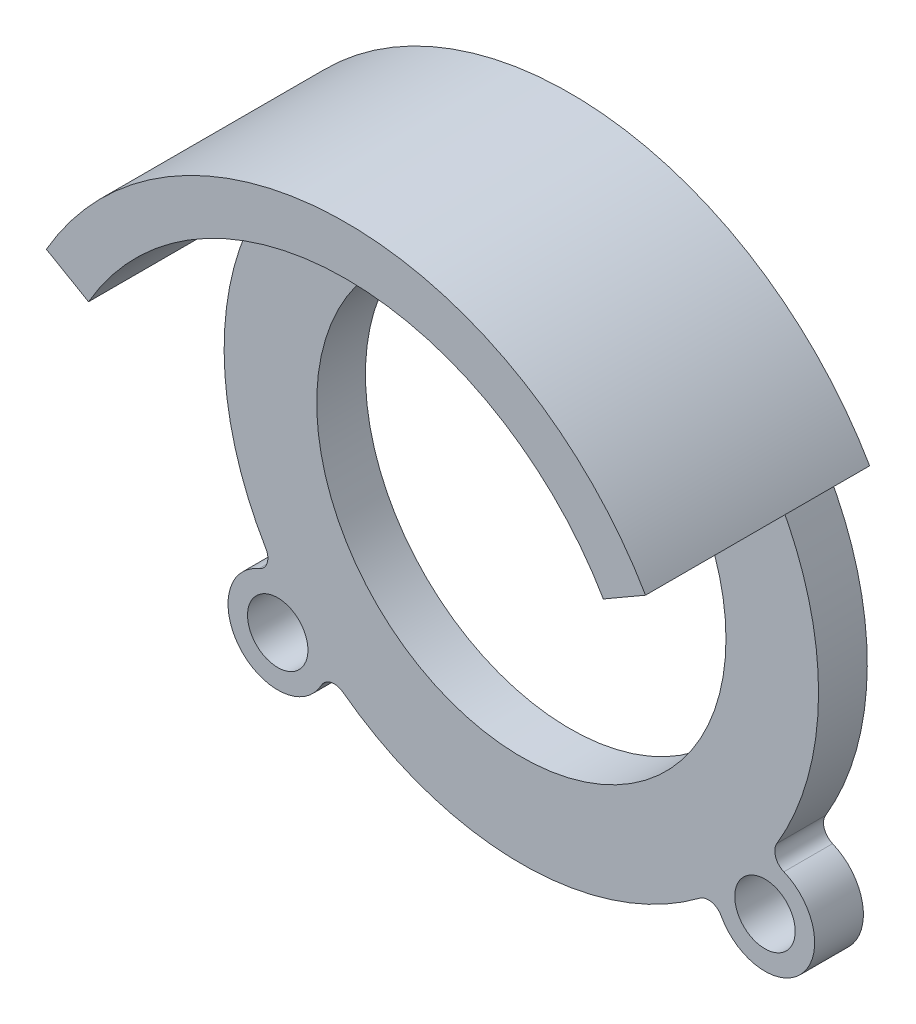
ISO-10303-21;
HEADER;
FILE_DESCRIPTION(('STEP AP214'),'2;1');
FILE_NAME('part.step','',(''),(''),'','','');
FILE_SCHEMA(('AUTOMOTIVE_DESIGN { 1 0 10303 214 1 1 1 1 }'));
ENDSEC;
DATA;
#1=APPLICATION_CONTEXT('core data for automotive mechanical design processes');
#2=APPLICATION_PROTOCOL_DEFINITION('international standard','automotive_design',2000,#1);
#3=PRODUCT_CONTEXT('',#1,'mechanical');
#4=PRODUCT('Part','Part','',(#3));
#5=PRODUCT_RELATED_PRODUCT_CATEGORY('part','',(#4));
#6=PRODUCT_DEFINITION_FORMATION('','',#4);
#7=PRODUCT_DEFINITION_CONTEXT('part definition',#1,'design');
#8=PRODUCT_DEFINITION('design','',#6,#7);
#9=PRODUCT_DEFINITION_SHAPE('','',#8);
#10=(LENGTH_UNIT() NAMED_UNIT(*) SI_UNIT(.MILLI.,.METRE.));
#11=(NAMED_UNIT(*) PLANE_ANGLE_UNIT() SI_UNIT($,.RADIAN.));
#12=(NAMED_UNIT(*) SI_UNIT($,.STERADIAN.) SOLID_ANGLE_UNIT());
#13=UNCERTAINTY_MEASURE_WITH_UNIT(LENGTH_MEASURE(1.E-05),#10,'distance_accuracy_value','');
#14=(GEOMETRIC_REPRESENTATION_CONTEXT(3) GLOBAL_UNCERTAINTY_ASSIGNED_CONTEXT((#13)) GLOBAL_UNIT_ASSIGNED_CONTEXT((#10,
#11,#12)) REPRESENTATION_CONTEXT('',''));
#15=CARTESIAN_POINT('',(0.,0.,0.));
#16=DIRECTION('',(0.,0.,1.));
#17=DIRECTION('',(1.,0.,0.));
#18=AXIS2_PLACEMENT_3D('',#15,#16,#17);
#19=CARTESIAN_POINT('',(0.,0.,5.));
#20=DIRECTION('',(0.,0.,-1.));
#21=DIRECTION('',(-1.,0.,0.));
#22=AXIS2_PLACEMENT_3D('',#19,#20,#21);
#23=PLANE('',#22);
#24=CARTESIAN_POINT('',(-25.,-22.4490534321606,5.));
#25=DIRECTION('',(0.,0.,1.));
#26=DIRECTION('',(1.,0.,0.));
#27=AXIS2_PLACEMENT_3D('',#24,#25,#26);
#28=CIRCLE('',#27,3.1);
#29=CARTESIAN_POINT('',(-21.9,-22.4490534321606,5.));
#30=VERTEX_POINT('',#29);
#31=EDGE_CURVE('E282',#30,#30,#28,.T.);
#32=ORIENTED_EDGE('',*,*,#31,.F.);
#33=EDGE_LOOP('',(#32));
#34=FACE_BOUND('',#33,.T.);
#35=CARTESIAN_POINT('',(25.,-22.4490534321606,5.));
#36=DIRECTION('',(0.,0.,1.));
#37=DIRECTION('',(1.,0.,0.));
#38=AXIS2_PLACEMENT_3D('',#35,#36,#37);
#39=CIRCLE('',#38,3.1);
#40=CARTESIAN_POINT('',(28.1,-22.4490534321606,5.));
#41=VERTEX_POINT('',#40);
#42=EDGE_CURVE('E274',#41,#41,#39,.T.);
#43=ORIENTED_EDGE('',*,*,#42,.F.);
#44=EDGE_LOOP('',(#43));
#45=FACE_BOUND('',#44,.T.);
#46=CARTESIAN_POINT('',(0.,0.,5.));
#47=DIRECTION('',(0.,0.,1.));
#48=DIRECTION('',(1.,0.,0.));
#49=AXIS2_PLACEMENT_3D('',#46,#47,#48);
#50=CIRCLE('',#49,21.);
#51=CARTESIAN_POINT('',(21.,0.,5.));
#52=VERTEX_POINT('',#51);
#53=EDGE_CURVE('E173',#52,#52,#50,.T.);
#54=ORIENTED_EDGE('',*,*,#53,.F.);
#55=EDGE_LOOP('',(#54));
#56=FACE_BOUND('',#55,.T.);
#57=CARTESIAN_POINT('',(0.,0.,5.));
#58=DIRECTION('',(0.,0.,-1.));
#59=DIRECTION('',(-1.,0.,0.));
#60=AXIS2_PLACEMENT_3D('',#57,#58,#59);
#61=CIRCLE('',#60,30.5);
#62=CARTESIAN_POINT('',(-26.4137748154254,15.2499999999999,5.));
#63=VERTEX_POINT('',#62);
#64=CARTESIAN_POINT('',(26.4137748154254,15.25,5.));
#65=VERTEX_POINT('',#64);
#66=EDGE_CURVE('E113',#63,#65,#61,.T.);
#67=ORIENTED_EDGE('',*,*,#66,.F.);
#68=CARTESIAN_POINT('',(0.,0.,5.));
#69=DIRECTION('',(0.,0.,1.));
#70=DIRECTION('',(1.,0.,0.));
#71=AXIS2_PLACEMENT_3D('',#68,#69,#70);
#72=CIRCLE('',#71,30.5);
#73=CARTESIAN_POINT('',(-26.2210538799125,-15.579035060835,5.));
#74=VERTEX_POINT('',#73);
#75=EDGE_CURVE('E203',#63,#74,#72,.T.);
#76=ORIENTED_EDGE('',*,*,#75,.T.);
#77=CARTESIAN_POINT('',(-27.5106139067934,-16.3452171130072,5.));
#78=DIRECTION('',(0.,0.,-1.));
#79=DIRECTION('',(1.,0.,0.));
#80=AXIS2_PLACEMENT_3D('',#77,#78,#79);
#81=CIRCLE('',#80,1.5);
#82=CARTESIAN_POINT('',(-26.9400198370676,-17.7324526400875,5.));
#83=VERTEX_POINT('',#82);
#84=EDGE_CURVE('E260',#74,#83,#81,.T.);
#85=ORIENTED_EDGE('',*,*,#84,.T.);
#86=CARTESIAN_POINT('',(-25.,-22.4490534321606,5.));
#87=DIRECTION('',(0.,0.,1.));
#88=DIRECTION('',(1.,0.,0.));
#89=AXIS2_PLACEMENT_3D('',#86,#87,#88);
#90=CIRCLE('',#89,5.1);
#91=CARTESIAN_POINT('',(-20.5185824485436,-24.8835753009262,5.));
#92=VERTEX_POINT('',#91);
#93=EDGE_CURVE('E256',#83,#92,#90,.T.);
#94=ORIENTED_EDGE('',*,*,#93,.T.);
#95=CARTESIAN_POINT('',(-19.2005184628211,-25.5996111446808,5.));
#96=DIRECTION('',(0.,0.,-1.));
#97=DIRECTION('',(1.,0.,0.));
#98=AXIS2_PLACEMENT_3D('',#95,#96,#97);
#99=CIRCLE('',#98,1.5);
#100=CARTESIAN_POINT('',(-18.3004941598763,-24.3996293722739,5.));
#101=VERTEX_POINT('',#100);
#102=EDGE_CURVE('E259',#92,#101,#99,.T.);
#103=ORIENTED_EDGE('',*,*,#102,.T.);
#104=CARTESIAN_POINT('',(0.,0.,5.));
#105=DIRECTION('',(0.,0.,1.));
#106=DIRECTION('',(1.,0.,0.));
#107=AXIS2_PLACEMENT_3D('',#104,#105,#106);
#108=CIRCLE('',#107,30.5);
#109=CARTESIAN_POINT('',(18.3004941598763,-24.3996293722739,5.));
#110=VERTEX_POINT('',#109);
#111=EDGE_CURVE('E139',#101,#110,#108,.T.);
#112=ORIENTED_EDGE('',*,*,#111,.T.);
#113=CARTESIAN_POINT('',(19.2005184628211,-25.5996111446808,5.));
#114=DIRECTION('',(0.,0.,-1.));
#115=DIRECTION('',(1.,0.,0.));
#116=AXIS2_PLACEMENT_3D('',#113,#114,#115);
#117=CIRCLE('',#116,1.5);
#118=CARTESIAN_POINT('',(20.5185824485436,-24.8835753009262,5.));
#119=VERTEX_POINT('',#118);
#120=EDGE_CURVE('E133',#110,#119,#117,.T.);
#121=ORIENTED_EDGE('',*,*,#120,.T.);
#122=CARTESIAN_POINT('',(25.,-22.4490534321606,5.));
#123=DIRECTION('',(0.,0.,1.));
#124=DIRECTION('',(1.,0.,0.));
#125=AXIS2_PLACEMENT_3D('',#122,#123,#124);
#126=CIRCLE('',#125,5.1);
#127=CARTESIAN_POINT('',(26.9400198370677,-17.7324526400875,5.));
#128=VERTEX_POINT('',#127);
#129=EDGE_CURVE('E136',#119,#128,#126,.T.);
#130=ORIENTED_EDGE('',*,*,#129,.T.);
#131=CARTESIAN_POINT('',(27.5106139067934,-16.3452171130072,5.));
#132=DIRECTION('',(0.,0.,-1.));
#133=DIRECTION('',(1.,0.,0.));
#134=AXIS2_PLACEMENT_3D('',#131,#132,#133);
#135=CIRCLE('',#134,1.5);
#136=CARTESIAN_POINT('',(26.2210538799125,-15.579035060835,5.));
#137=VERTEX_POINT('',#136);
#138=EDGE_CURVE('E57',#128,#137,#135,.T.);
#139=ORIENTED_EDGE('',*,*,#138,.T.);
#140=CARTESIAN_POINT('',(0.,0.,5.));
#141=DIRECTION('',(0.,0.,1.));
#142=DIRECTION('',(1.,0.,0.));
#143=AXIS2_PLACEMENT_3D('',#140,#141,#142);
#144=CIRCLE('',#143,30.5);
#145=EDGE_CURVE('E161',#137,#65,#144,.T.);
#146=ORIENTED_EDGE('',*,*,#145,.T.);
#147=EDGE_LOOP('',(#67,#76,#85,#94,#103,#112,#121,#130,#139,#146));
#148=FACE_BOUND('',#147,.T.);
#149=ADVANCED_FACE('F39',(#34,#45,#56,#148),#23,.F.);
#150=CARTESIAN_POINT('',(0.,0.,0.));
#151=DIRECTION('',(0.,0.,-1.));
#152=DIRECTION('',(-1.,0.,0.));
#153=AXIS2_PLACEMENT_3D('',#150,#151,#152);
#154=PLANE('',#153);
#155=CARTESIAN_POINT('',(25.,-22.4490534321606,0.));
#156=DIRECTION('',(0.,0.,1.));
#157=DIRECTION('',(1.,0.,0.));
#158=AXIS2_PLACEMENT_3D('',#155,#156,#157);
#159=CIRCLE('',#158,3.1);
#160=CARTESIAN_POINT('',(28.1,-22.4490534321606,0.));
#161=VERTEX_POINT('',#160);
#162=EDGE_CURVE('E278',#161,#161,#159,.T.);
#163=ORIENTED_EDGE('',*,*,#162,.T.);
#164=EDGE_LOOP('',(#163));
#165=FACE_BOUND('',#164,.T.);
#166=CARTESIAN_POINT('',(0.,0.,0.));
#167=DIRECTION('',(0.,0.,1.));
#168=DIRECTION('',(-1.,0.,0.));
#169=AXIS2_PLACEMENT_3D('',#166,#167,#168);
#170=CIRCLE('',#169,35.5);
#171=CARTESIAN_POINT('',(30.7439018343476,17.7499999999999,0.));
#172=VERTEX_POINT('',#171);
#173=CARTESIAN_POINT('',(-30.7439018343476,17.7499999999999,0.));
#174=VERTEX_POINT('',#173);
#175=EDGE_CURVE('E168',#172,#174,#170,.T.);
#176=ORIENTED_EDGE('',*,*,#175,.F.);
#177=DIRECTION('',(0.866025403784449,0.499999999999982,0.));
#178=VECTOR('',#177,1.);
#179=CARTESIAN_POINT('',(26.4137748154254,15.25,0.));
#180=LINE('',#179,#178);
#181=CARTESIAN_POINT('',(26.4137748154254,15.25,0.));
#182=VERTEX_POINT('',#181);
#183=EDGE_CURVE('E106',#182,#172,#180,.T.);
#184=ORIENTED_EDGE('',*,*,#183,.F.);
#185=CARTESIAN_POINT('',(0.,0.,0.));
#186=DIRECTION('',(0.,0.,1.));
#187=DIRECTION('',(1.,0.,0.));
#188=AXIS2_PLACEMENT_3D('',#185,#186,#187);
#189=CIRCLE('',#188,30.5);
#190=CARTESIAN_POINT('',(26.2210538799125,-15.579035060835,0.));
#191=VERTEX_POINT('',#190);
#192=EDGE_CURVE('E99',#191,#182,#189,.T.);
#193=ORIENTED_EDGE('',*,*,#192,.F.);
#194=CARTESIAN_POINT('',(27.5106139067934,-16.3452171130072,0.));
#195=DIRECTION('',(0.,0.,-1.));
#196=DIRECTION('',(1.,0.,0.));
#197=AXIS2_PLACEMENT_3D('',#194,#195,#196);
#198=CIRCLE('',#197,1.5);
#199=CARTESIAN_POINT('',(26.9400198370677,-17.7324526400875,0.));
#200=VERTEX_POINT('',#199);
#201=EDGE_CURVE('E196',#200,#191,#198,.T.);
#202=ORIENTED_EDGE('',*,*,#201,.F.);
#203=CARTESIAN_POINT('',(25.,-22.4490534321606,0.));
#204=DIRECTION('',(0.,0.,1.));
#205=DIRECTION('',(1.,0.,0.));
#206=AXIS2_PLACEMENT_3D('',#203,#204,#205);
#207=CIRCLE('',#206,5.1);
#208=CARTESIAN_POINT('',(20.5185824485436,-24.8835753009262,0.));
#209=VERTEX_POINT('',#208);
#210=EDGE_CURVE('E193',#209,#200,#207,.T.);
#211=ORIENTED_EDGE('',*,*,#210,.F.);
#212=CARTESIAN_POINT('',(19.2005184628211,-25.5996111446808,0.));
#213=DIRECTION('',(0.,0.,-1.));
#214=DIRECTION('',(1.,0.,0.));
#215=AXIS2_PLACEMENT_3D('',#212,#213,#214);
#216=CIRCLE('',#215,1.5);
#217=CARTESIAN_POINT('',(18.3004941598763,-24.3996293722739,0.));
#218=VERTEX_POINT('',#217);
#219=EDGE_CURVE('E149',#218,#209,#216,.T.);
#220=ORIENTED_EDGE('',*,*,#219,.F.);
#221=CARTESIAN_POINT('',(0.,0.,0.));
#222=DIRECTION('',(0.,0.,1.));
#223=DIRECTION('',(1.,0.,0.));
#224=AXIS2_PLACEMENT_3D('',#221,#222,#223);
#225=CIRCLE('',#224,30.5);
#226=CARTESIAN_POINT('',(-18.3004941598763,-24.3996293722739,0.));
#227=VERTEX_POINT('',#226);
#228=EDGE_CURVE('E188',#227,#218,#225,.T.);
#229=ORIENTED_EDGE('',*,*,#228,.F.);
#230=CARTESIAN_POINT('',(-19.2005184628211,-25.5996111446808,0.));
#231=DIRECTION('',(0.,0.,-1.));
#232=DIRECTION('',(1.,0.,0.));
#233=AXIS2_PLACEMENT_3D('',#230,#231,#232);
#234=CIRCLE('',#233,1.5);
#235=CARTESIAN_POINT('',(-20.5185824485436,-24.8835753009262,0.));
#236=VERTEX_POINT('',#235);
#237=EDGE_CURVE('E185',#236,#227,#234,.T.);
#238=ORIENTED_EDGE('',*,*,#237,.F.);
#239=CARTESIAN_POINT('',(-25.,-22.4490534321606,0.));
#240=DIRECTION('',(0.,0.,1.));
#241=DIRECTION('',(1.,0.,0.));
#242=AXIS2_PLACEMENT_3D('',#239,#240,#241);
#243=CIRCLE('',#242,5.1);
#244=CARTESIAN_POINT('',(-26.9400198370676,-17.7324526400875,0.));
#245=VERTEX_POINT('',#244);
#246=EDGE_CURVE('E182',#245,#236,#243,.T.);
#247=ORIENTED_EDGE('',*,*,#246,.F.);
#248=CARTESIAN_POINT('',(-27.5106139067934,-16.3452171130072,0.));
#249=DIRECTION('',(0.,0.,-1.));
#250=DIRECTION('',(1.,0.,0.));
#251=AXIS2_PLACEMENT_3D('',#248,#249,#250);
#252=CIRCLE('',#251,1.5);
#253=CARTESIAN_POINT('',(-26.2210538799125,-15.579035060835,0.));
#254=VERTEX_POINT('',#253);
#255=EDGE_CURVE('E179',#254,#245,#252,.T.);
#256=ORIENTED_EDGE('',*,*,#255,.F.);
#257=CARTESIAN_POINT('',(0.,0.,0.));
#258=DIRECTION('',(0.,0.,1.));
#259=DIRECTION('',(1.,0.,0.));
#260=AXIS2_PLACEMENT_3D('',#257,#258,#259);
#261=CIRCLE('',#260,30.5);
#262=CARTESIAN_POINT('',(-26.4137748154254,15.2499999999999,0.));
#263=VERTEX_POINT('',#262);
#264=EDGE_CURVE('E176',#263,#254,#261,.T.);
#265=ORIENTED_EDGE('',*,*,#264,.F.);
#266=DIRECTION('',(0.86602540378444,-0.499999999999998,0.));
#267=VECTOR('',#266,1.);
#268=CARTESIAN_POINT('',(-26.4137748154254,15.2499999999999,0.));
#269=LINE('',#268,#267);
#270=EDGE_CURVE('E172',#174,#263,#269,.T.);
#271=ORIENTED_EDGE('',*,*,#270,.F.);
#272=EDGE_LOOP('',(#176,#184,#193,#202,#211,#220,#229,#238,#247,#256,#265,#271));
#273=FACE_BOUND('',#272,.T.);
#274=CARTESIAN_POINT('',(0.,0.,0.));
#275=DIRECTION('',(0.,0.,1.));
#276=DIRECTION('',(1.,0.,0.));
#277=AXIS2_PLACEMENT_3D('',#274,#275,#276);
#278=CIRCLE('',#277,21.);
#279=CARTESIAN_POINT('',(21.,0.,0.));
#280=VERTEX_POINT('',#279);
#281=EDGE_CURVE('E270',#280,#280,#278,.T.);
#282=ORIENTED_EDGE('',*,*,#281,.T.);
#283=EDGE_LOOP('',(#282));
#284=FACE_BOUND('',#283,.T.);
#285=CARTESIAN_POINT('',(-25.,-22.4490534321606,0.));
#286=DIRECTION('',(0.,0.,1.));
#287=DIRECTION('',(1.,0.,0.));
#288=AXIS2_PLACEMENT_3D('',#285,#286,#287);
#289=CIRCLE('',#288,3.1);
#290=CARTESIAN_POINT('',(-21.9,-22.4490534321606,0.));
#291=VERTEX_POINT('',#290);
#292=EDGE_CURVE('E286',#291,#291,#289,.T.);
#293=ORIENTED_EDGE('',*,*,#292,.T.);
#294=EDGE_LOOP('',(#293));
#295=FACE_BOUND('',#294,.T.);
#296=ADVANCED_FACE('F244',(#165,#273,#284,#295),#154,.T.);
#297=CARTESIAN_POINT('',(0.,0.,5.));
#298=DIRECTION('',(0.,0.,-1.));
#299=DIRECTION('',(-1.,0.,0.));
#300=AXIS2_PLACEMENT_3D('',#297,#298,#299);
#301=CYLINDRICAL_SURFACE('',#300,35.5);
#302=ORIENTED_EDGE('',*,*,#175,.T.);
#303=DIRECTION('',(0.,0.,-1.));
#304=VECTOR('',#303,1.);
#305=CARTESIAN_POINT('',(-30.7439018343476,17.7499999999999,5.));
#306=LINE('',#305,#304);
#307=CARTESIAN_POINT('',(-30.7439018343476,17.75,23.));
#308=VERTEX_POINT('',#307);
#309=EDGE_CURVE('E11',#308,#174,#306,.T.);
#310=ORIENTED_EDGE('',*,*,#309,.F.);
#311=CARTESIAN_POINT('',(0.,0.,23.));
#312=DIRECTION('',(0.,0.,1.));
#313=DIRECTION('',(-1.,0.,0.));
#314=AXIS2_PLACEMENT_3D('',#311,#312,#313);
#315=CIRCLE('',#314,35.5);
#316=CARTESIAN_POINT('',(30.7439018343476,17.75,23.));
#317=VERTEX_POINT('',#316);
#318=EDGE_CURVE('E307',#317,#308,#315,.T.);
#319=ORIENTED_EDGE('',*,*,#318,.F.);
#320=DIRECTION('',(0.,0.,-1.));
#321=VECTOR('',#320,1.);
#322=CARTESIAN_POINT('',(30.7439018343476,17.7499999999999,5.));
#323=LINE('',#322,#321);
#324=EDGE_CURVE('E167',#317,#172,#323,.T.);
#325=ORIENTED_EDGE('',*,*,#324,.T.);
#326=EDGE_LOOP('',(#302,#310,#319,#325));
#327=FACE_BOUND('',#326,.T.);
#328=ADVANCED_FACE('F41',(#327),#301,.T.);
#329=CARTESIAN_POINT('',(-26.4137748154254,15.2499999999999,5.));
#330=DIRECTION('',(0.499999999999998,0.86602540378444,0.));
#331=DIRECTION('',(-0.86602540378444,0.499999999999998,0.));
#332=AXIS2_PLACEMENT_3D('',#329,#330,#331);
#333=PLANE('',#332);
#334=ORIENTED_EDGE('',*,*,#270,.T.);
#335=DIRECTION('',(0.,0.,-1.));
#336=VECTOR('',#335,1.);
#337=CARTESIAN_POINT('',(-26.4137748154254,15.2499999999999,5.));
#338=LINE('',#337,#336);
#339=EDGE_CURVE('E49',#63,#263,#338,.T.);
#340=ORIENTED_EDGE('',*,*,#339,.F.);
#341=DIRECTION('',(0.,0.,-1.));
#342=VECTOR('',#341,1.);
#343=CARTESIAN_POINT('',(-26.4137748154254,15.25,23.));
#344=LINE('',#343,#342);
#345=CARTESIAN_POINT('',(-26.4137748154254,15.25,23.));
#346=VERTEX_POINT('',#345);
#347=EDGE_CURVE('E297',#346,#63,#344,.T.);
#348=ORIENTED_EDGE('',*,*,#347,.F.);
#349=DIRECTION('',(0.866025403784438,-0.500000000000001,0.));
#350=VECTOR('',#349,1.);
#351=CARTESIAN_POINT('',(-26.4137748154254,15.25,23.));
#352=LINE('',#351,#350);
#353=EDGE_CURVE('E300',#308,#346,#352,.T.);
#354=ORIENTED_EDGE('',*,*,#353,.F.);
#355=ORIENTED_EDGE('',*,*,#309,.T.);
#356=EDGE_LOOP('',(#334,#340,#348,#354,#355));
#357=FACE_BOUND('',#356,.T.);
#358=ADVANCED_FACE('F339',(#357),#333,.F.);
#359=CARTESIAN_POINT('',(0.,0.,5.));
#360=DIRECTION('',(0.,0.,-1.));
#361=DIRECTION('',(-1.,0.,0.));
#362=AXIS2_PLACEMENT_3D('',#359,#360,#361);
#363=CYLINDRICAL_SURFACE('',#362,30.5);
#364=ORIENTED_EDGE('',*,*,#264,.T.);
#365=DIRECTION('',(0.,0.,-1.));
#366=VECTOR('',#365,1.);
#367=CARTESIAN_POINT('',(-26.2210538799125,-15.579035060835,5.));
#368=LINE('',#367,#366);
#369=EDGE_CURVE('E228',#74,#254,#368,.T.);
#370=ORIENTED_EDGE('',*,*,#369,.F.);
#371=ORIENTED_EDGE('',*,*,#75,.F.);
#372=ORIENTED_EDGE('',*,*,#339,.T.);
#373=EDGE_LOOP('',(#364,#370,#371,#372));
#374=FACE_BOUND('',#373,.T.);
#375=ADVANCED_FACE('F236',(#374),#363,.T.);
#376=CARTESIAN_POINT('',(-27.5106139067934,-16.3452171130072,5.));
#377=DIRECTION('',(0.,0.,-1.));
#378=DIRECTION('',(-1.,0.,0.));
#379=AXIS2_PLACEMENT_3D('',#376,#377,#378);
#380=CYLINDRICAL_SURFACE('',#379,1.5);
#381=ORIENTED_EDGE('',*,*,#255,.T.);
#382=DIRECTION('',(0.,0.,-1.));
#383=VECTOR('',#382,1.);
#384=CARTESIAN_POINT('',(-26.9400198370676,-17.7324526400875,5.));
#385=LINE('',#384,#383);
#386=EDGE_CURVE('E224',#83,#245,#385,.T.);
#387=ORIENTED_EDGE('',*,*,#386,.F.);
#388=ORIENTED_EDGE('',*,*,#84,.F.);
#389=ORIENTED_EDGE('',*,*,#369,.T.);
#390=EDGE_LOOP('',(#381,#387,#388,#389));
#391=FACE_BOUND('',#390,.T.);
#392=ADVANCED_FACE('F250',(#391),#380,.F.);
#393=CARTESIAN_POINT('',(-25.,-22.4490534321606,5.));
#394=DIRECTION('',(0.,0.,-1.));
#395=DIRECTION('',(-1.,0.,0.));
#396=AXIS2_PLACEMENT_3D('',#393,#394,#395);
#397=CYLINDRICAL_SURFACE('',#396,5.1);
#398=ORIENTED_EDGE('',*,*,#246,.T.);
#399=DIRECTION('',(0.,0.,-1.));
#400=VECTOR('',#399,1.);
#401=CARTESIAN_POINT('',(-20.5185824485436,-24.8835753009262,5.));
#402=LINE('',#401,#400);
#403=EDGE_CURVE('E220',#92,#236,#402,.T.);
#404=ORIENTED_EDGE('',*,*,#403,.F.);
#405=ORIENTED_EDGE('',*,*,#93,.F.);
#406=ORIENTED_EDGE('',*,*,#386,.T.);
#407=EDGE_LOOP('',(#398,#404,#405,#406));
#408=FACE_BOUND('',#407,.T.);
#409=ADVANCED_FACE('F254',(#408),#397,.T.);
#410=CARTESIAN_POINT('',(-19.2005184628211,-25.5996111446808,5.));
#411=DIRECTION('',(0.,0.,-1.));
#412=DIRECTION('',(-1.,0.,0.));
#413=AXIS2_PLACEMENT_3D('',#410,#411,#412);
#414=CYLINDRICAL_SURFACE('',#413,1.5);
#415=ORIENTED_EDGE('',*,*,#237,.T.);
#416=DIRECTION('',(0.,0.,-1.));
#417=VECTOR('',#416,1.);
#418=CARTESIAN_POINT('',(-18.3004941598763,-24.3996293722739,5.));
#419=LINE('',#418,#417);
#420=EDGE_CURVE('E216',#101,#227,#419,.T.);
#421=ORIENTED_EDGE('',*,*,#420,.F.);
#422=ORIENTED_EDGE('',*,*,#102,.F.);
#423=ORIENTED_EDGE('',*,*,#403,.T.);
#424=EDGE_LOOP('',(#415,#421,#422,#423));
#425=FACE_BOUND('',#424,.T.);
#426=ADVANCED_FACE('F374',(#425),#414,.F.);
#427=CARTESIAN_POINT('',(0.,0.,5.));
#428=DIRECTION('',(0.,0.,-1.));
#429=DIRECTION('',(-1.,0.,0.));
#430=AXIS2_PLACEMENT_3D('',#427,#428,#429);
#431=CYLINDRICAL_SURFACE('',#430,30.5);
#432=ORIENTED_EDGE('',*,*,#228,.T.);
#433=DIRECTION('',(0.,0.,-1.));
#434=VECTOR('',#433,1.);
#435=CARTESIAN_POINT('',(18.3004941598763,-24.3996293722739,5.));
#436=LINE('',#435,#434);
#437=EDGE_CURVE('E153',#110,#218,#436,.T.);
#438=ORIENTED_EDGE('',*,*,#437,.F.);
#439=ORIENTED_EDGE('',*,*,#111,.F.);
#440=ORIENTED_EDGE('',*,*,#420,.T.);
#441=EDGE_LOOP('',(#432,#438,#439,#440));
#442=FACE_BOUND('',#441,.T.);
#443=ADVANCED_FACE('F371',(#442),#431,.T.);
#444=CARTESIAN_POINT('',(19.2005184628211,-25.5996111446808,5.));
#445=DIRECTION('',(0.,0.,-1.));
#446=DIRECTION('',(-1.,0.,0.));
#447=AXIS2_PLACEMENT_3D('',#444,#445,#446);
#448=CYLINDRICAL_SURFACE('',#447,1.5);
#449=ORIENTED_EDGE('',*,*,#219,.T.);
#450=DIRECTION('',(0.,0.,-1.));
#451=VECTOR('',#450,1.);
#452=CARTESIAN_POINT('',(20.5185824485436,-24.8835753009262,5.));
#453=LINE('',#452,#451);
#454=EDGE_CURVE('E146',#119,#209,#453,.T.);
#455=ORIENTED_EDGE('',*,*,#454,.F.);
#456=ORIENTED_EDGE('',*,*,#120,.F.);
#457=ORIENTED_EDGE('',*,*,#437,.T.);
#458=EDGE_LOOP('',(#449,#455,#456,#457));
#459=FACE_BOUND('',#458,.T.);
#460=ADVANCED_FACE('F147',(#459),#448,.F.);
#461=CARTESIAN_POINT('',(25.,-22.4490534321606,5.));
#462=DIRECTION('',(0.,0.,-1.));
#463=DIRECTION('',(-1.,0.,0.));
#464=AXIS2_PLACEMENT_3D('',#461,#462,#463);
#465=CYLINDRICAL_SURFACE('',#464,5.1);
#466=ORIENTED_EDGE('',*,*,#210,.T.);
#467=DIRECTION('',(0.,0.,-1.));
#468=VECTOR('',#467,1.);
#469=CARTESIAN_POINT('',(26.9400198370677,-17.7324526400875,5.));
#470=LINE('',#469,#468);
#471=EDGE_CURVE('E154',#128,#200,#470,.T.);
#472=ORIENTED_EDGE('',*,*,#471,.F.);
#473=ORIENTED_EDGE('',*,*,#129,.F.);
#474=ORIENTED_EDGE('',*,*,#454,.T.);
#475=EDGE_LOOP('',(#466,#472,#473,#474));
#476=FACE_BOUND('',#475,.T.);
#477=ADVANCED_FACE('F156',(#476),#465,.T.);
#478=CARTESIAN_POINT('',(27.5106139067934,-16.3452171130072,5.));
#479=DIRECTION('',(0.,0.,-1.));
#480=DIRECTION('',(-1.,0.,0.));
#481=AXIS2_PLACEMENT_3D('',#478,#479,#480);
#482=CYLINDRICAL_SURFACE('',#481,1.5);
#483=ORIENTED_EDGE('',*,*,#201,.T.);
#484=DIRECTION('',(0.,0.,-1.));
#485=VECTOR('',#484,1.);
#486=CARTESIAN_POINT('',(26.2210538799125,-15.579035060835,5.));
#487=LINE('',#486,#485);
#488=EDGE_CURVE('E209',#137,#191,#487,.T.);
#489=ORIENTED_EDGE('',*,*,#488,.F.);
#490=ORIENTED_EDGE('',*,*,#138,.F.);
#491=ORIENTED_EDGE('',*,*,#471,.T.);
#492=EDGE_LOOP('',(#483,#489,#490,#491));
#493=FACE_BOUND('',#492,.T.);
#494=ADVANCED_FACE('F364',(#493),#482,.F.);
#495=CARTESIAN_POINT('',(0.,0.,5.));
#496=DIRECTION('',(0.,0.,-1.));
#497=DIRECTION('',(-1.,0.,0.));
#498=AXIS2_PLACEMENT_3D('',#495,#496,#497);
#499=CYLINDRICAL_SURFACE('',#498,30.5);
#500=ORIENTED_EDGE('',*,*,#192,.T.);
#501=DIRECTION('',(0.,0.,-1.));
#502=VECTOR('',#501,1.);
#503=CARTESIAN_POINT('',(26.4137748154254,15.25,5.));
#504=LINE('',#503,#502);
#505=EDGE_CURVE('E206',#65,#182,#504,.T.);
#506=ORIENTED_EDGE('',*,*,#505,.F.);
#507=ORIENTED_EDGE('',*,*,#145,.F.);
#508=ORIENTED_EDGE('',*,*,#488,.T.);
#509=EDGE_LOOP('',(#500,#506,#507,#508));
#510=FACE_BOUND('',#509,.T.);
#511=ADVANCED_FACE('F331',(#510),#499,.T.);
#512=CARTESIAN_POINT('',(26.4137748154254,15.25,5.));
#513=DIRECTION('',(-0.499999999999982,0.866025403784449,0.));
#514=DIRECTION('',(-0.866025403784449,-0.499999999999982,0.));
#515=AXIS2_PLACEMENT_3D('',#512,#513,#514);
#516=PLANE('',#515);
#517=ORIENTED_EDGE('',*,*,#183,.T.);
#518=ORIENTED_EDGE('',*,*,#324,.F.);
#519=DIRECTION('',(0.866025403784438,0.500000000000001,0.));
#520=VECTOR('',#519,1.);
#521=CARTESIAN_POINT('',(26.4137748154254,15.25,23.));
#522=LINE('',#521,#520);
#523=CARTESIAN_POINT('',(26.4137748154254,15.25,23.));
#524=VERTEX_POINT('',#523);
#525=EDGE_CURVE('E311',#524,#317,#522,.T.);
#526=ORIENTED_EDGE('',*,*,#525,.F.);
#527=DIRECTION('',(0.,0.,-1.));
#528=VECTOR('',#527,1.);
#529=CARTESIAN_POINT('',(26.4137748154254,15.25,23.));
#530=LINE('',#529,#528);
#531=EDGE_CURVE('E290',#524,#65,#530,.T.);
#532=ORIENTED_EDGE('',*,*,#531,.T.);
#533=ORIENTED_EDGE('',*,*,#505,.T.);
#534=EDGE_LOOP('',(#517,#518,#526,#532,#533));
#535=FACE_BOUND('',#534,.T.);
#536=ADVANCED_FACE('F329',(#535),#516,.F.);
#537=CARTESIAN_POINT('',(0.,0.,5.));
#538=DIRECTION('',(0.,0.,-1.));
#539=DIRECTION('',(-1.,0.,0.));
#540=AXIS2_PLACEMENT_3D('',#537,#538,#539);
#541=CYLINDRICAL_SURFACE('',#540,21.);
#542=ORIENTED_EDGE('',*,*,#53,.T.);
#543=EDGE_LOOP('',(#542));
#544=FACE_BOUND('',#543,.T.);
#545=ORIENTED_EDGE('',*,*,#281,.F.);
#546=EDGE_LOOP('',(#545));
#547=FACE_BOUND('',#546,.T.);
#548=ADVANCED_FACE('F357',(#544,#547),#541,.F.);
#549=CARTESIAN_POINT('',(25.,-22.4490534321606,5.));
#550=DIRECTION('',(0.,0.,-1.));
#551=DIRECTION('',(-1.,0.,0.));
#552=AXIS2_PLACEMENT_3D('',#549,#550,#551);
#553=CYLINDRICAL_SURFACE('',#552,3.1);
#554=ORIENTED_EDGE('',*,*,#42,.T.);
#555=EDGE_LOOP('',(#554));
#556=FACE_BOUND('',#555,.T.);
#557=ORIENTED_EDGE('',*,*,#162,.F.);
#558=EDGE_LOOP('',(#557));
#559=FACE_BOUND('',#558,.T.);
#560=ADVANCED_FACE('F426',(#556,#559),#553,.F.);
#561=CARTESIAN_POINT('',(-25.,-22.4490534321606,5.));
#562=DIRECTION('',(0.,0.,-1.));
#563=DIRECTION('',(-1.,0.,0.));
#564=AXIS2_PLACEMENT_3D('',#561,#562,#563);
#565=CYLINDRICAL_SURFACE('',#564,3.1);
#566=ORIENTED_EDGE('',*,*,#31,.T.);
#567=EDGE_LOOP('',(#566));
#568=FACE_BOUND('',#567,.T.);
#569=ORIENTED_EDGE('',*,*,#292,.F.);
#570=EDGE_LOOP('',(#569));
#571=FACE_BOUND('',#570,.T.);
#572=ADVANCED_FACE('F433',(#568,#571),#565,.F.);
#573=CARTESIAN_POINT('',(0.,0.,23.));
#574=DIRECTION('',(0.,0.,-1.));
#575=DIRECTION('',(-1.,0.,0.));
#576=AXIS2_PLACEMENT_3D('',#573,#574,#575);
#577=CYLINDRICAL_SURFACE('',#576,30.5);
#578=ORIENTED_EDGE('',*,*,#66,.T.);
#579=ORIENTED_EDGE('',*,*,#531,.F.);
#580=CARTESIAN_POINT('',(0.,0.,23.));
#581=DIRECTION('',(0.,0.,-1.));
#582=DIRECTION('',(-1.,0.,0.));
#583=AXIS2_PLACEMENT_3D('',#580,#581,#582);
#584=CIRCLE('',#583,30.5);
#585=EDGE_CURVE('E303',#346,#524,#584,.T.);
#586=ORIENTED_EDGE('',*,*,#585,.F.);
#587=ORIENTED_EDGE('',*,*,#347,.T.);
#588=EDGE_LOOP('',(#578,#579,#586,#587));
#589=FACE_BOUND('',#588,.T.);
#590=ADVANCED_FACE('F328',(#589),#577,.F.);
#591=CARTESIAN_POINT('',(0.,0.,23.));
#592=DIRECTION('',(0.,0.,-1.));
#593=DIRECTION('',(-1.,0.,0.));
#594=AXIS2_PLACEMENT_3D('',#591,#592,#593);
#595=PLANE('',#594);
#596=ORIENTED_EDGE('',*,*,#585,.T.);
#597=ORIENTED_EDGE('',*,*,#525,.T.);
#598=ORIENTED_EDGE('',*,*,#318,.T.);
#599=ORIENTED_EDGE('',*,*,#353,.T.);
#600=EDGE_LOOP('',(#596,#597,#598,#599));
#601=FACE_BOUND('',#600,.T.);
#602=ADVANCED_FACE('F321',(#601),#595,.F.);
#603=CLOSED_SHELL('',(#149,#296,#328,#358,#375,#392,#409,#426,#443,#460,#477,#494,#511,#536,
#548,#560,#572,#590,#602));
#604=MANIFOLD_SOLID_BREP('B2',#603);
#605=ADVANCED_BREP_SHAPE_REPRESENTATION('',(#18,#604),#14);
#606=SHAPE_DEFINITION_REPRESENTATION(#9,#605);
ENDSEC;
END-ISO-10303-21;
